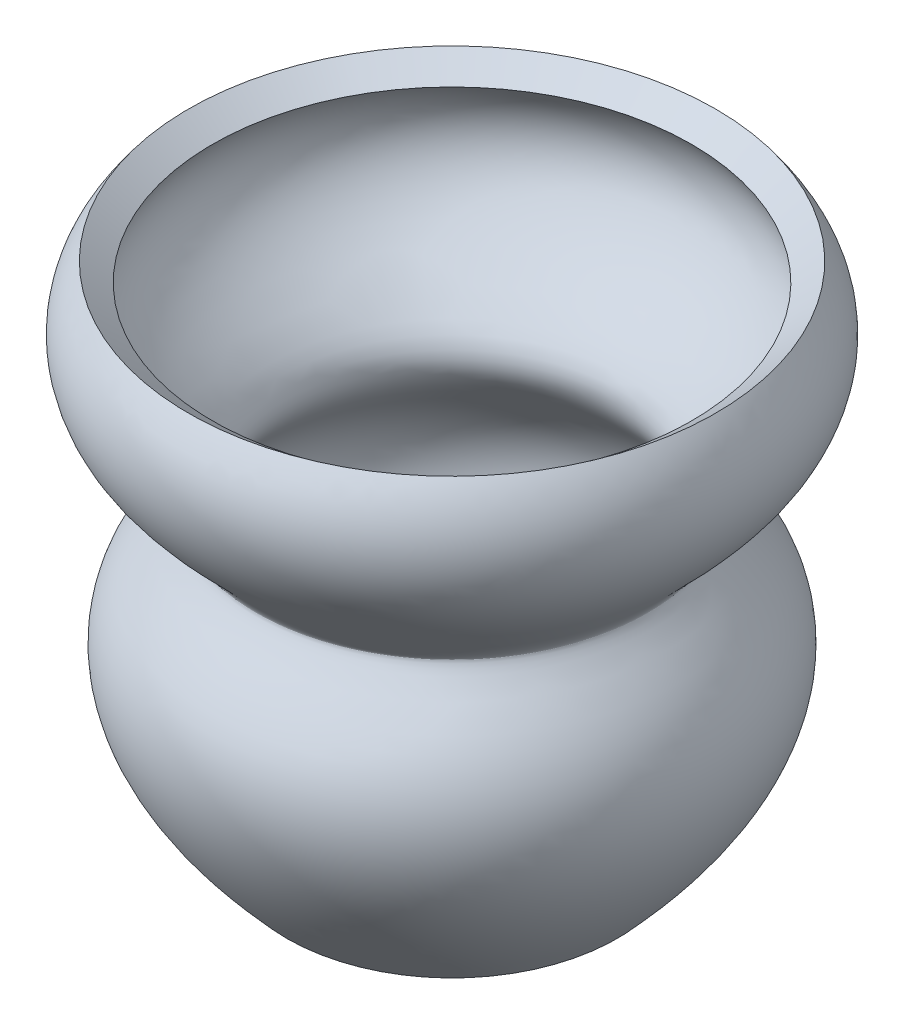
ISO-10303-21;
HEADER;
FILE_DESCRIPTION(('STEP AP214'),'2;1');
FILE_NAME('part.step','',(''),(''),'','','');
FILE_SCHEMA(('AUTOMOTIVE_DESIGN { 1 0 10303 214 1 1 1 1 }'));
ENDSEC;
DATA;
#1=APPLICATION_CONTEXT('core data for automotive mechanical design processes');
#2=APPLICATION_PROTOCOL_DEFINITION('international standard','automotive_design',2000,#1);
#3=PRODUCT_CONTEXT('',#1,'mechanical');
#4=PRODUCT('Part','Part','',(#3));
#5=PRODUCT_RELATED_PRODUCT_CATEGORY('part','',(#4));
#6=PRODUCT_DEFINITION_FORMATION('','',#4);
#7=PRODUCT_DEFINITION_CONTEXT('part definition',#1,'design');
#8=PRODUCT_DEFINITION('design','',#6,#7);
#9=PRODUCT_DEFINITION_SHAPE('','',#8);
#10=(LENGTH_UNIT() NAMED_UNIT(*) SI_UNIT(.MILLI.,.METRE.));
#11=(NAMED_UNIT(*) PLANE_ANGLE_UNIT() SI_UNIT($,.RADIAN.));
#12=(NAMED_UNIT(*) SI_UNIT($,.STERADIAN.) SOLID_ANGLE_UNIT());
#13=UNCERTAINTY_MEASURE_WITH_UNIT(LENGTH_MEASURE(1.E-05),#10,'distance_accuracy_value','');
#14=(GEOMETRIC_REPRESENTATION_CONTEXT(3) GLOBAL_UNCERTAINTY_ASSIGNED_CONTEXT((#13)) GLOBAL_UNIT_ASSIGNED_CONTEXT((#10,
#11,#12)) REPRESENTATION_CONTEXT('',''));
#15=CARTESIAN_POINT('',(0.,0.,0.));
#16=DIRECTION('',(0.,0.,1.));
#17=DIRECTION('',(1.,0.,0.));
#18=AXIS2_PLACEMENT_3D('',#15,#16,#17);
#19=CARTESIAN_POINT('',(0.,0.,0.));
#20=DIRECTION('',(0.,1.,0.));
#21=DIRECTION('',(0.,0.,1.));
#22=AXIS2_PLACEMENT_3D('',#19,#20,#21);
#23=PLANE('',#22);
#24=CARTESIAN_POINT('',(0.,0.,0.));
#25=DIRECTION('',(0.,-1.,0.));
#26=DIRECTION('',(0.,0.,-1.));
#27=AXIS2_PLACEMENT_3D('',#24,#25,#26);
#28=CIRCLE('',#27,25.);
#29=CARTESIAN_POINT('',(0.,0.,-25.));
#30=VERTEX_POINT('',#29);
#31=EDGE_CURVE('E10',#30,#30,#28,.T.);
#32=ORIENTED_EDGE('',*,*,#31,.F.);
#33=EDGE_LOOP('',(#32));
#34=FACE_BOUND('',#33,.T.);
#35=ADVANCED_FACE('F37',(#34),#23,.T.);
#36=CARTESIAN_POINT('',(39.4787814232496,74.9845244824478,0.));
#37=CARTESIAN_POINT('',(48.9621054713595,62.7706599696025,0.));
#38=CARTESIAN_POINT('',(2.76332704968208,37.683942782192,0.));
#39=CARTESIAN_POINT('',(54.1229110206799,32.5335691775904,0.));
#40=CARTESIAN_POINT('',(25.,0.,0.));
#41=B_SPLINE_CURVE_WITH_KNOTS('',3,(#36,#37,#38,#39,#40),.UNSPECIFIED.,.F.,.F.,(4,1,4),(0.,
0.376687267427345,1.),.UNSPECIFIED.);
#42=CARTESIAN_POINT('',(0.,0.,0.));
#43=DIRECTION('',(0.,-1.,0.));
#44=AXIS1_PLACEMENT('',#42,#43);
#45=SURFACE_OF_REVOLUTION('',#41,#44);
#46=ORIENTED_EDGE('',*,*,#31,.T.);
#47=EDGE_LOOP('',(#46));
#48=FACE_BOUND('',#47,.T.);
#49=CARTESIAN_POINT('',(0.,74.9845244824478,0.));
#50=DIRECTION('',(0.,-1.,0.));
#51=DIRECTION('',(0.,0.,-1.));
#52=AXIS2_PLACEMENT_3D('',#49,#50,#51);
#53=CIRCLE('',#52,39.4787814232496);
#54=CARTESIAN_POINT('',(0.,74.9845244824478,-39.4787814232496));
#55=VERTEX_POINT('',#54);
#56=EDGE_CURVE('E44',#55,#55,#53,.T.);
#57=ORIENTED_EDGE('',*,*,#56,.F.);
#58=EDGE_LOOP('',(#57));
#59=FACE_BOUND('',#58,.T.);
#60=ADVANCED_FACE('F70',(#48,#59),#45,.F.);
#61=CARTESIAN_POINT('',(0.,78.0509327737687,0.));
#62=DIRECTION('',(0.,1.,0.));
#63=DIRECTION('',(0.,0.,1.));
#64=AXIS2_PLACEMENT_3D('',#61,#62,#63);
#65=CONICAL_SURFACE('',#64,43.4281029081275,0.910587692292727);
#66=ORIENTED_EDGE('',*,*,#56,.T.);
#67=EDGE_LOOP('',(#66));
#68=FACE_BOUND('',#67,.T.);
#69=CARTESIAN_POINT('',(0.,78.0509327737687,0.));
#70=DIRECTION('',(0.,-1.,0.));
#71=DIRECTION('',(0.,0.,-1.));
#72=AXIS2_PLACEMENT_3D('',#69,#70,#71);
#73=CIRCLE('',#72,43.4281029081275);
#74=CARTESIAN_POINT('',(0.,78.0509327737687,-43.4281029081275));
#75=VERTEX_POINT('',#74);
#76=EDGE_CURVE('E49',#75,#75,#73,.T.);
#77=ORIENTED_EDGE('',*,*,#76,.F.);
#78=EDGE_LOOP('',(#77));
#79=FACE_BOUND('',#78,.T.);
#80=ADVANCED_FACE('F73',(#68,#79),#65,.F.);
#81=CARTESIAN_POINT('',(27.234838932461,-5.00000000000017,0.));
#82=CARTESIAN_POINT('',(27.6037424489724,-4.58789325470411,0.));
#83=CARTESIAN_POINT('',(28.1541515741525,-3.97240097036605,0.));
#84=CARTESIAN_POINT('',(28.8998150060739,-3.1410732568245,0.));
#85=CARTESIAN_POINT('',(30.0437699118297,-1.84765793064557,0.));
#86=CARTESIAN_POINT('',(32.3378524297665,0.854691764183562,0.));
#87=CARTESIAN_POINT('',(35.3479295401799,4.807230278286,0.));
#88=CARTESIAN_POINT('',(38.1580211606184,9.22584827171853,0.));
#89=CARTESIAN_POINT('',(40.2402142171537,13.385762461313,0.));
#90=CARTESIAN_POINT('',(41.6369158168635,17.3322233205363,0.));
#91=CARTESIAN_POINT('',(42.630012655341,22.3446138745232,0.));
#92=CARTESIAN_POINT('',(42.2681112351532,28.1162961196682,0.));
#93=CARTESIAN_POINT('',(39.9273277181344,33.69705840147,0.));
#94=CARTESIAN_POINT('',(36.9023275861638,37.8721517913083,0.));
#95=CARTESIAN_POINT('',(34.5844476419252,40.5186207077527,0.));
#96=CARTESIAN_POINT('',(33.2352972472385,42.1973979596285,0.));
#97=CARTESIAN_POINT('',(32.5629552700841,43.1904321034723,0.));
#98=CARTESIAN_POINT('',(32.27185688215,43.82498853201,0.));
#99=CARTESIAN_POINT('',(32.2566175943377,44.001781731132,0.));
#100=CARTESIAN_POINT('',(32.2532242273549,43.9360909271275,0.));
#101=CARTESIAN_POINT('',(32.2884534315764,44.1371680601332,0.));
#102=CARTESIAN_POINT('',(32.5752473982795,44.6358858403511,0.));
#103=CARTESIAN_POINT('',(33.125631306524,45.4060674608827,0.));
#104=CARTESIAN_POINT('',(34.2283154765015,46.6820413519634,0.));
#105=CARTESIAN_POINT('',(36.0299196818343,48.5307684535298,0.));
#106=CARTESIAN_POINT('',(38.8225828663308,51.3298650774454,0.));
#107=CARTESIAN_POINT('',(42.6308088289176,55.4011698820595,0.));
#108=CARTESIAN_POINT('',(45.9048901948486,60.4948898288604,0.));
#109=CARTESIAN_POINT('',(47.3046157091957,65.5525704018725,0.));
#110=CARTESIAN_POINT('',(47.3301803453267,69.0654129174917,0.));
#111=CARTESIAN_POINT('',(46.7145537818772,71.9139650933784,0.));
#112=CARTESIAN_POINT('',(45.9339682950344,74.0255115891567,0.));
#113=CARTESIAN_POINT('',(44.856671432097,76.0686080465353,0.));
#114=CARTESIAN_POINT('',(43.9218784834143,77.4149840340958,0.));
#115=CARTESIAN_POINT('',(43.4281029081275,78.0509327737687,0.));
#116=B_SPLINE_CURVE_WITH_KNOTS('',3,(#81,#82,#83,#84,#85,#86,#87,#88,#89,#90,#91,#92,#93,#94,
#95,#96,#97,#98,#99,#100,#101,#102,#103,#104,#105,#106,#107,#108,#109,#110,#111,#112,#113,#114,
#115),.UNSPECIFIED.,.F.,.F.,(4,1,1,1,1,1,1,1,1,1,1,1,1,1,1,1,1,1,1,1,1,1,1,1,1,1,1,1,1,1,1,1,4),
(-0.010634174668979,-0.00273859517937762,0.00120919456542308,0.00515698431022378,
0.0209481432894266,0.0525304612478322,0.0841127792062378,0.115695097164643,0.147277415123049,
0.178859733081455,0.242024368998266,0.305189004915077,0.368353640831888,0.431518276748699,
0.463100594707105,0.494682912665511,0.526265230623916,0.557847548582322,0.589429866540727,
0.621012184499133,0.636803343478336,0.652594502457538,0.684176820415944,0.71575913837435,
0.747341456332755,0.810506092249566,0.873670728166378,0.905253046124783,0.936835364083189,
0.952626523062392,0.968417682041594,0.984208841020797,1.),.UNSPECIFIED.);
#117=CARTESIAN_POINT('',(0.,0.,0.));
#118=DIRECTION('',(0.,-1.,0.));
#119=AXIS1_PLACEMENT('',#117,#118);
#120=SURFACE_OF_REVOLUTION('',#116,#119);
#121=ORIENTED_EDGE('',*,*,#76,.T.);
#122=EDGE_LOOP('',(#121));
#123=FACE_BOUND('',#122,.T.);
#124=CARTESIAN_POINT('',(0.,-5.00000000000017,0.));
#125=DIRECTION('',(0.,-1.,0.));
#126=DIRECTION('',(0.,0.,-1.));
#127=AXIS2_PLACEMENT_3D('',#124,#125,#126);
#128=CIRCLE('',#127,27.234838932461);
#129=CARTESIAN_POINT('',(0.,-5.00000000000017,-27.234838932461));
#130=VERTEX_POINT('',#129);
#131=EDGE_CURVE('E54',#130,#130,#128,.T.);
#132=ORIENTED_EDGE('',*,*,#131,.F.);
#133=EDGE_LOOP('',(#132));
#134=FACE_BOUND('',#133,.T.);
#135=ADVANCED_FACE('F76',(#123,#134),#120,.F.);
#136=CARTESIAN_POINT('',(0.,-5.00000000000008,0.));
#137=DIRECTION('',(0.,-1.,0.));
#138=DIRECTION('',(0.,0.,-1.));
#139=AXIS2_PLACEMENT_3D('',#136,#137,#138);
#140=PLANE('',#139);
#141=ORIENTED_EDGE('',*,*,#131,.T.);
#142=EDGE_LOOP('',(#141));
#143=FACE_BOUND('',#142,.T.);
#144=ADVANCED_FACE('F79',(#143),#140,.T.);
#145=CLOSED_SHELL('',(#35,#60,#80,#135,#144));
#146=MANIFOLD_SOLID_BREP('B2',#145);
#147=ADVANCED_BREP_SHAPE_REPRESENTATION('',(#18,#146),#14);
#148=SHAPE_DEFINITION_REPRESENTATION(#9,#147);
ENDSEC;
END-ISO-10303-21;
